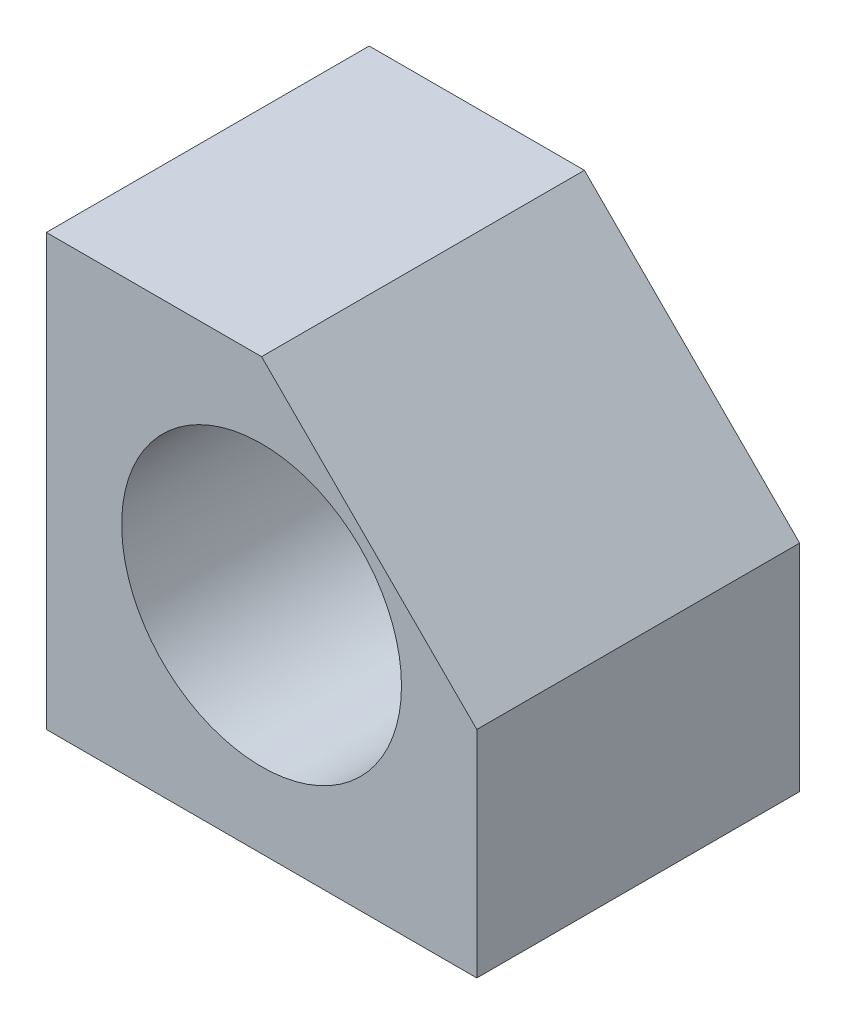
ISO-10303-21;
HEADER;
FILE_DESCRIPTION(('STEP AP214'),'2;1');
FILE_NAME('part.step','',(''),(''),'','','');
FILE_SCHEMA(('AUTOMOTIVE_DESIGN { 1 0 10303 214 1 1 1 1 }'));
ENDSEC;
DATA;
#1=APPLICATION_CONTEXT('core data for automotive mechanical design processes');
#2=APPLICATION_PROTOCOL_DEFINITION('international standard','automotive_design',2000,#1);
#3=PRODUCT_CONTEXT('',#1,'mechanical');
#4=PRODUCT('Part','Part','',(#3));
#5=PRODUCT_RELATED_PRODUCT_CATEGORY('part','',(#4));
#6=PRODUCT_DEFINITION_FORMATION('','',#4);
#7=PRODUCT_DEFINITION_CONTEXT('part definition',#1,'design');
#8=PRODUCT_DEFINITION('design','',#6,#7);
#9=PRODUCT_DEFINITION_SHAPE('','',#8);
#10=(LENGTH_UNIT() NAMED_UNIT(*) SI_UNIT(.MILLI.,.METRE.));
#11=(NAMED_UNIT(*) PLANE_ANGLE_UNIT() SI_UNIT($,.RADIAN.));
#12=(NAMED_UNIT(*) SI_UNIT($,.STERADIAN.) SOLID_ANGLE_UNIT());
#13=UNCERTAINTY_MEASURE_WITH_UNIT(LENGTH_MEASURE(1.E-05),#10,'distance_accuracy_value','');
#14=(GEOMETRIC_REPRESENTATION_CONTEXT(3) GLOBAL_UNCERTAINTY_ASSIGNED_CONTEXT((#13)) GLOBAL_UNIT_ASSIGNED_CONTEXT((#10,
#11,#12)) REPRESENTATION_CONTEXT('',''));
#15=CARTESIAN_POINT('',(0.,0.,0.));
#16=DIRECTION('',(0.,0.,1.));
#17=DIRECTION('',(1.,0.,0.));
#18=AXIS2_PLACEMENT_3D('',#15,#16,#17);
#19=CARTESIAN_POINT('',(0.,-62.420000001026,3.));
#20=DIRECTION('',(0.,-1.,0.));
#21=DIRECTION('',(0.,0.,-1.));
#22=AXIS2_PLACEMENT_3D('',#19,#20,#21);
#23=PLANE('',#22);
#24=DIRECTION('',(-1.,0.,0.));
#25=VECTOR('',#24,1.);
#26=CARTESIAN_POINT('',(0.,-62.420000001026,0.));
#27=LINE('',#26,#25);
#28=CARTESIAN_POINT('',(169.269999999161,-62.420000001026,0.));
#29=VERTEX_POINT('',#28);
#30=CARTESIAN_POINT('',(165.269999999161,-62.420000001026,0.));
#31=VERTEX_POINT('',#30);
#32=EDGE_CURVE('E102',#29,#31,#27,.T.);
#33=ORIENTED_EDGE('',*,*,#32,.F.);
#34=DIRECTION('',(0.,0.,-1.));
#35=VECTOR('',#34,1.);
#36=CARTESIAN_POINT('',(169.269999999161,-62.420000001026,3.));
#37=LINE('',#36,#35);
#38=CARTESIAN_POINT('',(169.269999999161,-62.420000001026,3.));
#39=VERTEX_POINT('',#38);
#40=EDGE_CURVE('E98',#39,#29,#37,.T.);
#41=ORIENTED_EDGE('',*,*,#40,.F.);
#42=DIRECTION('',(-1.,0.,0.));
#43=VECTOR('',#42,1.);
#44=CARTESIAN_POINT('',(0.,-62.420000001026,3.));
#45=LINE('',#44,#43);
#46=CARTESIAN_POINT('',(165.269999999161,-62.420000001026,3.));
#47=VERTEX_POINT('',#46);
#48=EDGE_CURVE('E100',#39,#47,#45,.T.);
#49=ORIENTED_EDGE('',*,*,#48,.T.);
#50=DIRECTION('',(0.,0.,-1.));
#51=VECTOR('',#50,1.);
#52=CARTESIAN_POINT('',(165.269999999161,-62.420000001026,3.));
#53=LINE('',#52,#51);
#54=EDGE_CURVE('E132',#47,#31,#53,.T.);
#55=ORIENTED_EDGE('',*,*,#54,.T.);
#56=EDGE_LOOP('',(#33,#41,#49,#55));
#57=FACE_BOUND('',#56,.T.);
#58=ADVANCED_FACE('F49',(#57),#23,.T.);
#59=CARTESIAN_POINT('',(169.26999999916,1.17454657110855E-12,3.));
#60=DIRECTION('',(-1.,0.,0.));
#61=DIRECTION('',(0.,-1.,0.));
#62=AXIS2_PLACEMENT_3D('',#59,#60,#61);
#63=PLANE('',#62);
#64=DIRECTION('',(0.,1.,0.));
#65=VECTOR('',#64,1.);
#66=CARTESIAN_POINT('',(169.26999999916,1.17454657110855E-12,0.));
#67=LINE('',#66,#65);
#68=CARTESIAN_POINT('',(169.269999999161,-60.420000001026,0.));
#69=VERTEX_POINT('',#68);
#70=EDGE_CURVE('E139',#29,#69,#67,.T.);
#71=ORIENTED_EDGE('',*,*,#70,.T.);
#72=DIRECTION('',(0.,0.,1.));
#73=VECTOR('',#72,1.);
#74=CARTESIAN_POINT('',(169.269999999161,-60.420000001026,3.));
#75=LINE('',#74,#73);
#76=CARTESIAN_POINT('',(169.269999999161,-60.420000001026,3.));
#77=VERTEX_POINT('',#76);
#78=EDGE_CURVE('E59',#69,#77,#75,.T.);
#79=ORIENTED_EDGE('',*,*,#78,.T.);
#80=DIRECTION('',(0.,1.,0.));
#81=VECTOR('',#80,1.);
#82=CARTESIAN_POINT('',(169.26999999916,1.17454657110855E-12,3.));
#83=LINE('',#82,#81);
#84=EDGE_CURVE('E107',#39,#77,#83,.T.);
#85=ORIENTED_EDGE('',*,*,#84,.F.);
#86=ORIENTED_EDGE('',*,*,#40,.T.);
#87=EDGE_LOOP('',(#71,#79,#85,#86));
#88=FACE_BOUND('',#87,.T.);
#89=ADVANCED_FACE('F108',(#88),#63,.F.);
#90=CARTESIAN_POINT('',(0.,-58.420000001026,3.));
#91=DIRECTION('',(0.,1.,0.));
#92=DIRECTION('',(0.,0.,1.));
#93=AXIS2_PLACEMENT_3D('',#90,#91,#92);
#94=PLANE('',#93);
#95=DIRECTION('',(1.,0.,0.));
#96=VECTOR('',#95,1.);
#97=CARTESIAN_POINT('',(0.,-58.420000001026,3.));
#98=LINE('',#97,#96);
#99=CARTESIAN_POINT('',(165.269999999161,-58.420000001026,3.));
#100=VERTEX_POINT('',#99);
#101=CARTESIAN_POINT('',(167.269999999161,-58.420000001026,3.));
#102=VERTEX_POINT('',#101);
#103=EDGE_CURVE('E112',#100,#102,#98,.T.);
#104=ORIENTED_EDGE('',*,*,#103,.T.);
#105=DIRECTION('',(0.,0.,-1.));
#106=VECTOR('',#105,1.);
#107=CARTESIAN_POINT('',(167.269999999161,-58.420000001026,0.));
#108=LINE('',#107,#106);
#109=CARTESIAN_POINT('',(167.269999999161,-58.420000001026,0.));
#110=VERTEX_POINT('',#109);
#111=EDGE_CURVE('E104',#102,#110,#108,.T.);
#112=ORIENTED_EDGE('',*,*,#111,.T.);
#113=DIRECTION('',(1.,0.,0.));
#114=VECTOR('',#113,1.);
#115=CARTESIAN_POINT('',(0.,-58.420000001026,0.));
#116=LINE('',#115,#114);
#117=CARTESIAN_POINT('',(165.269999999161,-58.420000001026,0.));
#118=VERTEX_POINT('',#117);
#119=EDGE_CURVE('E142',#118,#110,#116,.T.);
#120=ORIENTED_EDGE('',*,*,#119,.F.);
#121=DIRECTION('',(0.,0.,-1.));
#122=VECTOR('',#121,1.);
#123=CARTESIAN_POINT('',(165.269999999161,-58.420000001026,3.));
#124=LINE('',#123,#122);
#125=EDGE_CURVE('E105',#100,#118,#124,.T.);
#126=ORIENTED_EDGE('',*,*,#125,.F.);
#127=EDGE_LOOP('',(#104,#112,#120,#126));
#128=FACE_BOUND('',#127,.T.);
#129=ADVANCED_FACE('F160',(#128),#94,.T.);
#130=CARTESIAN_POINT('',(167.269999999161,-60.420000001026,3.));
#131=DIRECTION('',(0.,0.,-1.));
#132=DIRECTION('',(-1.,0.,0.));
#133=AXIS2_PLACEMENT_3D('',#130,#131,#132);
#134=CYLINDRICAL_SURFACE('',#133,1.30000000000001);
#135=CARTESIAN_POINT('',(167.269999999161,-60.420000001026,3.));
#136=DIRECTION('',(0.,0.,1.));
#137=DIRECTION('',(1.,0.,0.));
#138=AXIS2_PLACEMENT_3D('',#135,#136,#137);
#139=CIRCLE('',#138,1.30000000000001);
#140=CARTESIAN_POINT('',(168.569999999161,-60.420000001026,3.));
#141=VERTEX_POINT('',#140);
#142=EDGE_CURVE('E120',#141,#141,#139,.T.);
#143=ORIENTED_EDGE('',*,*,#142,.T.);
#144=EDGE_LOOP('',(#143));
#145=FACE_BOUND('',#144,.T.);
#146=CARTESIAN_POINT('',(167.269999999161,-60.420000001026,0.));
#147=DIRECTION('',(0.,0.,1.));
#148=DIRECTION('',(1.,0.,0.));
#149=AXIS2_PLACEMENT_3D('',#146,#147,#148);
#150=CIRCLE('',#149,1.30000000000001);
#151=CARTESIAN_POINT('',(168.569999999161,-60.420000001026,0.));
#152=VERTEX_POINT('',#151);
#153=EDGE_CURVE('E133',#152,#152,#150,.T.);
#154=ORIENTED_EDGE('',*,*,#153,.F.);
#155=EDGE_LOOP('',(#154));
#156=FACE_BOUND('',#155,.T.);
#157=ADVANCED_FACE('F179',(#145,#156),#134,.F.);
#158=CARTESIAN_POINT('',(165.269999999161,0.,3.));
#159=DIRECTION('',(1.,0.,0.));
#160=DIRECTION('',(0.,0.,-1.));
#161=AXIS2_PLACEMENT_3D('',#158,#159,#160);
#162=PLANE('',#161);
#163=DIRECTION('',(0.,-1.,0.));
#164=VECTOR('',#163,1.);
#165=CARTESIAN_POINT('',(165.269999999161,0.,0.));
#166=LINE('',#165,#164);
#167=EDGE_CURVE('E124',#118,#31,#166,.T.);
#168=ORIENTED_EDGE('',*,*,#167,.T.);
#169=ORIENTED_EDGE('',*,*,#54,.F.);
#170=DIRECTION('',(0.,-1.,0.));
#171=VECTOR('',#170,1.);
#172=CARTESIAN_POINT('',(165.269999999161,0.,3.));
#173=LINE('',#172,#171);
#174=EDGE_CURVE('E117',#100,#47,#173,.T.);
#175=ORIENTED_EDGE('',*,*,#174,.F.);
#176=ORIENTED_EDGE('',*,*,#125,.T.);
#177=EDGE_LOOP('',(#168,#169,#175,#176));
#178=FACE_BOUND('',#177,.T.);
#179=ADVANCED_FACE('F165',(#178),#162,.F.);
#180=CARTESIAN_POINT('',(0.,0.,3.));
#181=DIRECTION('',(0.,0.,1.));
#182=DIRECTION('',(1.,0.,0.));
#183=AXIS2_PLACEMENT_3D('',#180,#181,#182);
#184=PLANE('',#183);
#185=ORIENTED_EDGE('',*,*,#142,.F.);
#186=EDGE_LOOP('',(#185));
#187=FACE_BOUND('',#186,.T.);
#188=ORIENTED_EDGE('',*,*,#84,.T.);
#189=DIRECTION('',(-0.707106781186546,0.707106781186549,0.));
#190=VECTOR('',#189,1.);
#191=CARTESIAN_POINT('',(54.4249999990676,54.4249999990674,3.));
#192=LINE('',#191,#190);
#193=EDGE_CURVE('E11',#77,#102,#192,.T.);
#194=ORIENTED_EDGE('',*,*,#193,.T.);
#195=ORIENTED_EDGE('',*,*,#103,.F.);
#196=ORIENTED_EDGE('',*,*,#174,.T.);
#197=ORIENTED_EDGE('',*,*,#48,.F.);
#198=EDGE_LOOP('',(#188,#194,#195,#196,#197));
#199=FACE_BOUND('',#198,.T.);
#200=ADVANCED_FACE('F114',(#187,#199),#184,.T.);
#201=CARTESIAN_POINT('',(0.,0.,0.));
#202=DIRECTION('',(0.,0.,1.));
#203=DIRECTION('',(1.,0.,0.));
#204=AXIS2_PLACEMENT_3D('',#201,#202,#203);
#205=PLANE('',#204);
#206=ORIENTED_EDGE('',*,*,#153,.T.);
#207=EDGE_LOOP('',(#206));
#208=FACE_BOUND('',#207,.T.);
#209=ORIENTED_EDGE('',*,*,#119,.T.);
#210=DIRECTION('',(0.707106781186546,-0.707106781186549,0.));
#211=VECTOR('',#210,1.);
#212=CARTESIAN_POINT('',(167.269999999161,-58.420000001026,0.));
#213=LINE('',#212,#211);
#214=EDGE_CURVE('E73',#110,#69,#213,.T.);
#215=ORIENTED_EDGE('',*,*,#214,.T.);
#216=ORIENTED_EDGE('',*,*,#70,.F.);
#217=ORIENTED_EDGE('',*,*,#32,.T.);
#218=ORIENTED_EDGE('',*,*,#167,.F.);
#219=EDGE_LOOP('',(#209,#215,#216,#217,#218));
#220=FACE_BOUND('',#219,.T.);
#221=ADVANCED_FACE('F163',(#208,#220),#205,.F.);
#222=CARTESIAN_POINT('',(167.269999999161,-58.420000001026,3.));
#223=DIRECTION('',(0.707106781186549,0.707106781186546,0.));
#224=DIRECTION('',(0.,0.,1.));
#225=AXIS2_PLACEMENT_3D('',#222,#223,#224);
#226=PLANE('',#225);
#227=ORIENTED_EDGE('',*,*,#193,.F.);
#228=ORIENTED_EDGE('',*,*,#78,.F.);
#229=ORIENTED_EDGE('',*,*,#214,.F.);
#230=ORIENTED_EDGE('',*,*,#111,.F.);
#231=EDGE_LOOP('',(#227,#228,#229,#230));
#232=FACE_BOUND('',#231,.T.);
#233=ADVANCED_FACE('F52',(#232),#226,.T.);
#234=CLOSED_SHELL('',(#58,#89,#129,#157,#179,#200,#221,#233));
#235=MANIFOLD_SOLID_BREP('B2',#234);
#236=ADVANCED_BREP_SHAPE_REPRESENTATION('',(#18,#235),#14);
#237=SHAPE_DEFINITION_REPRESENTATION(#9,#236);
ENDSEC;
END-ISO-10303-21;
